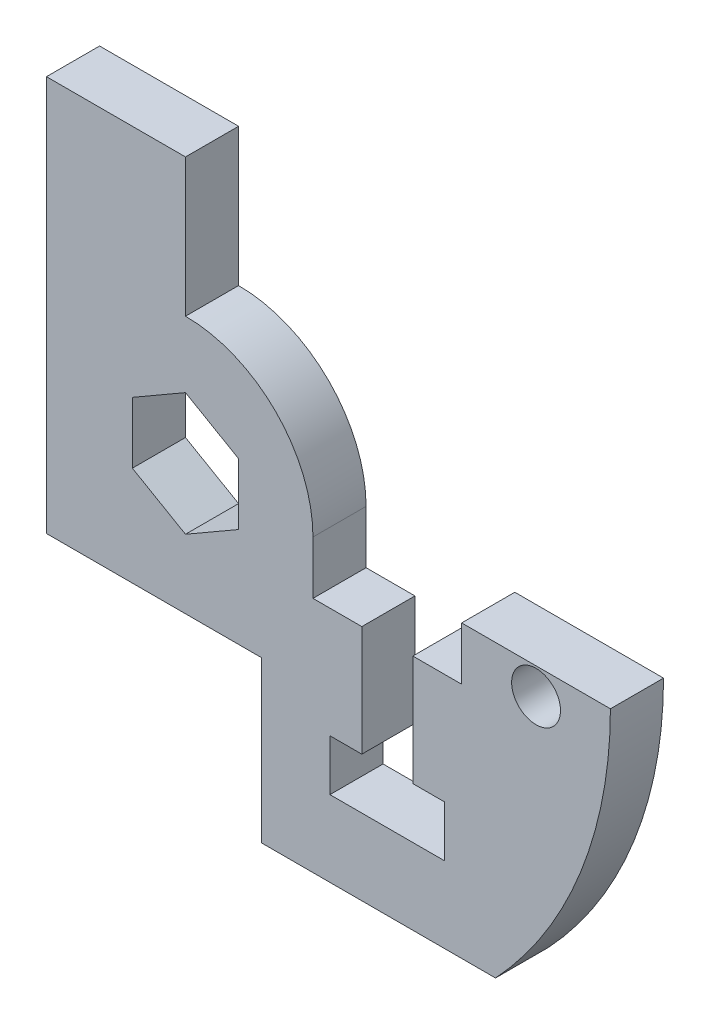
ISO-10303-21;
HEADER;
FILE_DESCRIPTION(('STEP AP214'),'2;1');
FILE_NAME('part.step','',(''),(''),'','','');
FILE_SCHEMA(('AUTOMOTIVE_DESIGN { 1 0 10303 214 1 1 1 1 }'));
ENDSEC;
DATA;
#1=APPLICATION_CONTEXT('core data for automotive mechanical design processes');
#2=APPLICATION_PROTOCOL_DEFINITION('international standard','automotive_design',2000,#1);
#3=PRODUCT_CONTEXT('',#1,'mechanical');
#4=PRODUCT('Part','Part','',(#3));
#5=PRODUCT_RELATED_PRODUCT_CATEGORY('part','',(#4));
#6=PRODUCT_DEFINITION_FORMATION('','',#4);
#7=PRODUCT_DEFINITION_CONTEXT('part definition',#1,'design');
#8=PRODUCT_DEFINITION('design','',#6,#7);
#9=PRODUCT_DEFINITION_SHAPE('','',#8);
#10=(LENGTH_UNIT() NAMED_UNIT(*) SI_UNIT(.MILLI.,.METRE.));
#11=(NAMED_UNIT(*) PLANE_ANGLE_UNIT() SI_UNIT($,.RADIAN.));
#12=(NAMED_UNIT(*) SI_UNIT($,.STERADIAN.) SOLID_ANGLE_UNIT());
#13=UNCERTAINTY_MEASURE_WITH_UNIT(LENGTH_MEASURE(1.E-05),#10,'distance_accuracy_value','');
#14=(GEOMETRIC_REPRESENTATION_CONTEXT(3) GLOBAL_UNCERTAINTY_ASSIGNED_CONTEXT((#13)) GLOBAL_UNIT_ASSIGNED_CONTEXT((#10,
#11,#12)) REPRESENTATION_CONTEXT('',''));
#15=CARTESIAN_POINT('',(0.,0.,0.));
#16=DIRECTION('',(0.,0.,1.));
#17=DIRECTION('',(1.,0.,0.));
#18=AXIS2_PLACEMENT_3D('',#15,#16,#17);
#19=CARTESIAN_POINT('',(0.,0.,3.175));
#20=DIRECTION('',(0.,0.,-1.));
#21=DIRECTION('',(-1.,0.,0.));
#22=AXIS2_PLACEMENT_3D('',#19,#20,#21);
#23=CYLINDRICAL_SURFACE('',#22,25.4);
#24=CARTESIAN_POINT('',(0.,0.,3.175));
#25=DIRECTION('',(0.,0.,1.));
#26=DIRECTION('',(1.,0.,0.));
#27=AXIS2_PLACEMENT_3D('',#24,#25,#26);
#28=CIRCLE('',#27,25.4);
#29=CARTESIAN_POINT('',(18.5310926745735,-17.371200427327,3.175));
#30=VERTEX_POINT('',#29);
#31=CARTESIAN_POINT('',(25.4,0.,3.175));
#32=VERTEX_POINT('',#31);
#33=EDGE_CURVE('E302',#30,#32,#28,.T.);
#34=ORIENTED_EDGE('',*,*,#33,.F.);
#35=DIRECTION('',(0.,0.,-1.));
#36=VECTOR('',#35,1.);
#37=CARTESIAN_POINT('',(18.5310926745735,-17.371200427327,3.175));
#38=LINE('',#37,#36);
#39=CARTESIAN_POINT('',(18.5310926745735,-17.371200427327,0.));
#40=VERTEX_POINT('',#39);
#41=EDGE_CURVE('E224',#30,#40,#38,.T.);
#42=ORIENTED_EDGE('',*,*,#41,.T.);
#43=CARTESIAN_POINT('',(0.,0.,0.));
#44=DIRECTION('',(0.,0.,1.));
#45=DIRECTION('',(1.,0.,0.));
#46=AXIS2_PLACEMENT_3D('',#43,#44,#45);
#47=CIRCLE('',#46,25.4);
#48=CARTESIAN_POINT('',(25.4,0.,0.));
#49=VERTEX_POINT('',#48);
#50=EDGE_CURVE('E233',#40,#49,#47,.T.);
#51=ORIENTED_EDGE('',*,*,#50,.T.);
#52=DIRECTION('',(0.,0.,-1.));
#53=VECTOR('',#52,1.);
#54=CARTESIAN_POINT('',(25.4,0.,3.175));
#55=LINE('',#54,#53);
#56=EDGE_CURVE('E454',#32,#49,#55,.T.);
#57=ORIENTED_EDGE('',*,*,#56,.F.);
#58=EDGE_LOOP('',(#34,#42,#51,#57));
#59=FACE_BOUND('',#58,.T.);
#60=ADVANCED_FACE('F42',(#59),#23,.T.);
#61=CARTESIAN_POINT('',(7.62,0.,3.175));
#62=DIRECTION('',(1.,0.,0.));
#63=DIRECTION('',(0.,0.,-1.));
#64=AXIS2_PLACEMENT_3D('',#61,#62,#63);
#65=PLANE('',#64);
#66=DIRECTION('',(0.,-1.,0.));
#67=VECTOR('',#66,1.);
#68=CARTESIAN_POINT('',(7.62,0.,0.));
#69=LINE('',#68,#67);
#70=CARTESIAN_POINT('',(7.62,0.,0.));
#71=VERTEX_POINT('',#70);
#72=CARTESIAN_POINT('',(7.62,-3.175,0.));
#73=VERTEX_POINT('',#72);
#74=EDGE_CURVE('E368',#71,#73,#69,.T.);
#75=ORIENTED_EDGE('',*,*,#74,.F.);
#76=DIRECTION('',(0.,0.,-1.));
#77=VECTOR('',#76,1.);
#78=CARTESIAN_POINT('',(7.62,0.,3.175));
#79=LINE('',#78,#77);
#80=CARTESIAN_POINT('',(7.62,0.,3.175));
#81=VERTEX_POINT('',#80);
#82=EDGE_CURVE('E11',#81,#71,#79,.T.);
#83=ORIENTED_EDGE('',*,*,#82,.F.);
#84=DIRECTION('',(0.,-1.,0.));
#85=VECTOR('',#84,1.);
#86=CARTESIAN_POINT('',(7.62,0.,3.175));
#87=LINE('',#86,#85);
#88=CARTESIAN_POINT('',(7.62,-3.175,3.175));
#89=VERTEX_POINT('',#88);
#90=EDGE_CURVE('E291',#81,#89,#87,.T.);
#91=ORIENTED_EDGE('',*,*,#90,.T.);
#92=DIRECTION('',(0.,0.,-1.));
#93=VECTOR('',#92,1.);
#94=CARTESIAN_POINT('',(7.62,-3.175,3.175));
#95=LINE('',#94,#93);
#96=EDGE_CURVE('E418',#89,#73,#95,.T.);
#97=ORIENTED_EDGE('',*,*,#96,.T.);
#98=EDGE_LOOP('',(#75,#83,#91,#97));
#99=FACE_BOUND('',#98,.T.);
#100=ADVANCED_FACE('F513',(#99),#65,.T.);
#101=CARTESIAN_POINT('',(0.,0.,3.175));
#102=DIRECTION('',(0.,0.,-1.));
#103=DIRECTION('',(-1.,0.,0.));
#104=AXIS2_PLACEMENT_3D('',#101,#102,#103);
#105=CYLINDRICAL_SURFACE('',#104,7.62);
#106=CARTESIAN_POINT('',(0.,0.,0.));
#107=DIRECTION('',(0.,0.,1.));
#108=DIRECTION('',(1.,0.,0.));
#109=AXIS2_PLACEMENT_3D('',#106,#107,#108);
#110=CIRCLE('',#109,7.62);
#111=CARTESIAN_POINT('',(0.,7.62,0.));
#112=VERTEX_POINT('',#111);
#113=EDGE_CURVE('E372',#71,#112,#110,.T.);
#114=ORIENTED_EDGE('',*,*,#113,.T.);
#115=DIRECTION('',(0.,0.,-1.));
#116=VECTOR('',#115,1.);
#117=CARTESIAN_POINT('',(0.,7.62,3.175));
#118=LINE('',#117,#116);
#119=CARTESIAN_POINT('',(0.,7.62,3.175));
#120=VERTEX_POINT('',#119);
#121=EDGE_CURVE('E52',#120,#112,#118,.T.);
#122=ORIENTED_EDGE('',*,*,#121,.F.);
#123=CARTESIAN_POINT('',(0.,0.,3.175));
#124=DIRECTION('',(0.,0.,1.));
#125=DIRECTION('',(1.,0.,0.));
#126=AXIS2_PLACEMENT_3D('',#123,#124,#125);
#127=CIRCLE('',#126,7.62);
#128=EDGE_CURVE('E295',#81,#120,#127,.T.);
#129=ORIENTED_EDGE('',*,*,#128,.F.);
#130=ORIENTED_EDGE('',*,*,#82,.T.);
#131=EDGE_LOOP('',(#114,#122,#129,#130));
#132=FACE_BOUND('',#131,.T.);
#133=ADVANCED_FACE('F521',(#132),#105,.T.);
#134=CARTESIAN_POINT('',(0.,0.,3.175));
#135=DIRECTION('',(1.,0.,0.));
#136=DIRECTION('',(0.,1.,0.));
#137=AXIS2_PLACEMENT_3D('',#134,#135,#136);
#138=PLANE('',#137);
#139=DIRECTION('',(0.,0.,-1.));
#140=VECTOR('',#139,1.);
#141=CARTESIAN_POINT('',(0.,15.8669720038918,3.176));
#142=LINE('',#141,#140);
#143=CARTESIAN_POINT('',(0.,15.8669720038918,3.175));
#144=VERTEX_POINT('',#143);
#145=CARTESIAN_POINT('',(0.,15.8669720038918,0.));
#146=VERTEX_POINT('',#145);
#147=EDGE_CURVE('E250',#144,#146,#142,.T.);
#148=ORIENTED_EDGE('',*,*,#147,.F.);
#149=DIRECTION('',(0.,-1.,0.));
#150=VECTOR('',#149,1.);
#151=CARTESIAN_POINT('',(0.,0.,3.175));
#152=LINE('',#151,#150);
#153=EDGE_CURVE('E299',#144,#120,#152,.T.);
#154=ORIENTED_EDGE('',*,*,#153,.T.);
#155=ORIENTED_EDGE('',*,*,#121,.T.);
#156=DIRECTION('',(0.,-1.,0.));
#157=VECTOR('',#156,1.);
#158=CARTESIAN_POINT('',(0.,0.,0.));
#159=LINE('',#158,#157);
#160=EDGE_CURVE('E376',#146,#112,#159,.T.);
#161=ORIENTED_EDGE('',*,*,#160,.F.);
#162=EDGE_LOOP('',(#148,#154,#155,#161));
#163=FACE_BOUND('',#162,.T.);
#164=ADVANCED_FACE('F528',(#163),#138,.T.);
#165=CARTESIAN_POINT('',(0.,0.,3.175));
#166=DIRECTION('',(0.,-1.,0.));
#167=DIRECTION('',(1.,0.,0.));
#168=AXIS2_PLACEMENT_3D('',#165,#166,#167);
#169=PLANE('',#168);
#170=DIRECTION('',(-1.,0.,0.));
#171=VECTOR('',#170,1.);
#172=CARTESIAN_POINT('',(0.,0.,0.));
#173=LINE('',#172,#171);
#174=CARTESIAN_POINT('',(16.51,0.,0.));
#175=VERTEX_POINT('',#174);
#176=EDGE_CURVE('E381',#49,#175,#173,.T.);
#177=ORIENTED_EDGE('',*,*,#176,.T.);
#178=DIRECTION('',(0.,0.,-1.));
#179=VECTOR('',#178,1.);
#180=CARTESIAN_POINT('',(16.51,0.,3.175));
#181=LINE('',#180,#179);
#182=CARTESIAN_POINT('',(16.51,0.,3.175));
#183=VERTEX_POINT('',#182);
#184=EDGE_CURVE('E450',#183,#175,#181,.T.);
#185=ORIENTED_EDGE('',*,*,#184,.F.);
#186=DIRECTION('',(-1.,0.,0.));
#187=VECTOR('',#186,1.);
#188=CARTESIAN_POINT('',(0.,0.,3.175));
#189=LINE('',#188,#187);
#190=EDGE_CURVE('E305',#32,#183,#189,.T.);
#191=ORIENTED_EDGE('',*,*,#190,.F.);
#192=ORIENTED_EDGE('',*,*,#56,.T.);
#193=EDGE_LOOP('',(#177,#185,#191,#192));
#194=FACE_BOUND('',#193,.T.);
#195=ADVANCED_FACE('F526',(#194),#169,.F.);
#196=CARTESIAN_POINT('',(16.51,0.,3.175));
#197=DIRECTION('',(1.,0.,0.));
#198=DIRECTION('',(0.,0.,-1.));
#199=AXIS2_PLACEMENT_3D('',#196,#197,#198);
#200=PLANE('',#199);
#201=DIRECTION('',(0.,-1.,0.));
#202=VECTOR('',#201,1.);
#203=CARTESIAN_POINT('',(16.51,0.,0.));
#204=LINE('',#203,#202);
#205=CARTESIAN_POINT('',(16.51,-3.175,0.));
#206=VERTEX_POINT('',#205);
#207=EDGE_CURVE('E385',#175,#206,#204,.T.);
#208=ORIENTED_EDGE('',*,*,#207,.T.);
#209=DIRECTION('',(0.,0.,-1.));
#210=VECTOR('',#209,1.);
#211=CARTESIAN_POINT('',(16.51,-3.175,3.175));
#212=LINE('',#211,#210);
#213=CARTESIAN_POINT('',(16.51,-3.175,3.175));
#214=VERTEX_POINT('',#213);
#215=EDGE_CURVE('E447',#214,#206,#212,.T.);
#216=ORIENTED_EDGE('',*,*,#215,.F.);
#217=DIRECTION('',(0.,-1.,0.));
#218=VECTOR('',#217,1.);
#219=CARTESIAN_POINT('',(16.51,0.,3.175));
#220=LINE('',#219,#218);
#221=EDGE_CURVE('E309',#183,#214,#220,.T.);
#222=ORIENTED_EDGE('',*,*,#221,.F.);
#223=ORIENTED_EDGE('',*,*,#184,.T.);
#224=EDGE_LOOP('',(#208,#216,#222,#223));
#225=FACE_BOUND('',#224,.T.);
#226=ADVANCED_FACE('F589',(#225),#200,.F.);
#227=CARTESIAN_POINT('',(0.,-3.175,3.175));
#228=DIRECTION('',(0.,1.,0.));
#229=DIRECTION('',(0.,0.,1.));
#230=AXIS2_PLACEMENT_3D('',#227,#228,#229);
#231=PLANE('',#230);
#232=DIRECTION('',(1.,0.,0.));
#233=VECTOR('',#232,1.);
#234=CARTESIAN_POINT('',(0.,-3.175,0.));
#235=LINE('',#234,#233);
#236=CARTESIAN_POINT('',(13.589,-3.175,0.));
#237=VERTEX_POINT('',#236);
#238=EDGE_CURVE('E389',#237,#206,#235,.T.);
#239=ORIENTED_EDGE('',*,*,#238,.F.);
#240=DIRECTION('',(0.,0.,-1.));
#241=VECTOR('',#240,1.);
#242=CARTESIAN_POINT('',(13.589,-3.175,3.175));
#243=LINE('',#242,#241);
#244=CARTESIAN_POINT('',(13.589,-3.175,3.175));
#245=VERTEX_POINT('',#244);
#246=EDGE_CURVE('E444',#245,#237,#243,.T.);
#247=ORIENTED_EDGE('',*,*,#246,.F.);
#248=DIRECTION('',(1.,0.,0.));
#249=VECTOR('',#248,1.);
#250=CARTESIAN_POINT('',(0.,-3.175,3.175));
#251=LINE('',#250,#249);
#252=EDGE_CURVE('E312',#245,#214,#251,.T.);
#253=ORIENTED_EDGE('',*,*,#252,.T.);
#254=ORIENTED_EDGE('',*,*,#215,.T.);
#255=EDGE_LOOP('',(#239,#247,#253,#254));
#256=FACE_BOUND('',#255,.T.);
#257=ADVANCED_FACE('F584',(#256),#231,.T.);
#258=CARTESIAN_POINT('',(13.589,0.,3.175));
#259=DIRECTION('',(1.,0.,0.));
#260=DIRECTION('',(0.,1.,0.));
#261=AXIS2_PLACEMENT_3D('',#258,#259,#260);
#262=PLANE('',#261);
#263=DIRECTION('',(0.,-1.,0.));
#264=VECTOR('',#263,1.);
#265=CARTESIAN_POINT('',(13.589,0.,0.));
#266=LINE('',#265,#264);
#267=CARTESIAN_POINT('',(13.589,-9.779,0.));
#268=VERTEX_POINT('',#267);
#269=EDGE_CURVE('E393',#237,#268,#266,.T.);
#270=ORIENTED_EDGE('',*,*,#269,.T.);
#271=DIRECTION('',(0.,0.,-1.));
#272=VECTOR('',#271,1.);
#273=CARTESIAN_POINT('',(13.589,-9.779,3.175));
#274=LINE('',#273,#272);
#275=CARTESIAN_POINT('',(13.589,-9.779,3.175));
#276=VERTEX_POINT('',#275);
#277=EDGE_CURVE('E440',#276,#268,#274,.T.);
#278=ORIENTED_EDGE('',*,*,#277,.F.);
#279=DIRECTION('',(0.,-1.,0.));
#280=VECTOR('',#279,1.);
#281=CARTESIAN_POINT('',(13.589,0.,3.175));
#282=LINE('',#281,#280);
#283=EDGE_CURVE('E316',#245,#276,#282,.T.);
#284=ORIENTED_EDGE('',*,*,#283,.F.);
#285=ORIENTED_EDGE('',*,*,#246,.T.);
#286=EDGE_LOOP('',(#270,#278,#284,#285));
#287=FACE_BOUND('',#286,.T.);
#288=ADVANCED_FACE('F622',(#287),#262,.F.);
#289=CARTESIAN_POINT('',(0.,-9.779,3.175));
#290=DIRECTION('',(0.,1.,0.));
#291=DIRECTION('',(-1.,0.,0.));
#292=AXIS2_PLACEMENT_3D('',#289,#290,#291);
#293=PLANE('',#292);
#294=DIRECTION('',(1.,0.,0.));
#295=VECTOR('',#294,1.);
#296=CARTESIAN_POINT('',(0.,-9.779,0.));
#297=LINE('',#296,#295);
#298=CARTESIAN_POINT('',(15.494,-9.779,0.));
#299=VERTEX_POINT('',#298);
#300=EDGE_CURVE('E397',#268,#299,#297,.T.);
#301=ORIENTED_EDGE('',*,*,#300,.T.);
#302=DIRECTION('',(0.,0.,-1.));
#303=VECTOR('',#302,1.);
#304=CARTESIAN_POINT('',(15.494,-9.779,3.175));
#305=LINE('',#304,#303);
#306=CARTESIAN_POINT('',(15.494,-9.779,3.175));
#307=VERTEX_POINT('',#306);
#308=EDGE_CURVE('E436',#307,#299,#305,.T.);
#309=ORIENTED_EDGE('',*,*,#308,.F.);
#310=DIRECTION('',(1.,0.,0.));
#311=VECTOR('',#310,1.);
#312=CARTESIAN_POINT('',(0.,-9.779,3.175));
#313=LINE('',#312,#311);
#314=EDGE_CURVE('E321',#276,#307,#313,.T.);
#315=ORIENTED_EDGE('',*,*,#314,.F.);
#316=ORIENTED_EDGE('',*,*,#277,.T.);
#317=EDGE_LOOP('',(#301,#309,#315,#316));
#318=FACE_BOUND('',#317,.T.);
#319=ADVANCED_FACE('F578',(#318),#293,.F.);
#320=CARTESIAN_POINT('',(15.494,0.,3.175));
#321=DIRECTION('',(1.,0.,0.));
#322=DIRECTION('',(0.,0.,-1.));
#323=AXIS2_PLACEMENT_3D('',#320,#321,#322);
#324=PLANE('',#323);
#325=DIRECTION('',(0.,-1.,0.));
#326=VECTOR('',#325,1.);
#327=CARTESIAN_POINT('',(15.494,0.,0.));
#328=LINE('',#327,#326);
#329=CARTESIAN_POINT('',(15.494,-12.827,0.));
#330=VERTEX_POINT('',#329);
#331=EDGE_CURVE('E401',#299,#330,#328,.T.);
#332=ORIENTED_EDGE('',*,*,#331,.T.);
#333=DIRECTION('',(0.,0.,-1.));
#334=VECTOR('',#333,1.);
#335=CARTESIAN_POINT('',(15.494,-12.827,3.175));
#336=LINE('',#335,#334);
#337=CARTESIAN_POINT('',(15.494,-12.827,3.175));
#338=VERTEX_POINT('',#337);
#339=EDGE_CURVE('E433',#338,#330,#336,.T.);
#340=ORIENTED_EDGE('',*,*,#339,.F.);
#341=DIRECTION('',(0.,-1.,0.));
#342=VECTOR('',#341,1.);
#343=CARTESIAN_POINT('',(15.494,0.,3.175));
#344=LINE('',#343,#342);
#345=EDGE_CURVE('E325',#307,#338,#344,.T.);
#346=ORIENTED_EDGE('',*,*,#345,.F.);
#347=ORIENTED_EDGE('',*,*,#308,.T.);
#348=EDGE_LOOP('',(#332,#340,#346,#347));
#349=FACE_BOUND('',#348,.T.);
#350=ADVANCED_FACE('F575',(#349),#324,.F.);
#351=CARTESIAN_POINT('',(0.,-12.827,3.175));
#352=DIRECTION('',(0.,1.,0.));
#353=DIRECTION('',(-1.,0.,0.));
#354=AXIS2_PLACEMENT_3D('',#351,#352,#353);
#355=PLANE('',#354);
#356=DIRECTION('',(1.,0.,0.));
#357=VECTOR('',#356,1.);
#358=CARTESIAN_POINT('',(0.,-12.827,0.));
#359=LINE('',#358,#357);
#360=CARTESIAN_POINT('',(8.636,-12.827,0.));
#361=VERTEX_POINT('',#360);
#362=EDGE_CURVE('E406',#361,#330,#359,.T.);
#363=ORIENTED_EDGE('',*,*,#362,.F.);
#364=DIRECTION('',(0.,0.,-1.));
#365=VECTOR('',#364,1.);
#366=CARTESIAN_POINT('',(8.636,-12.827,3.175));
#367=LINE('',#366,#365);
#368=CARTESIAN_POINT('',(8.636,-12.827,3.175));
#369=VERTEX_POINT('',#368);
#370=EDGE_CURVE('E430',#369,#361,#367,.T.);
#371=ORIENTED_EDGE('',*,*,#370,.F.);
#372=DIRECTION('',(1.,0.,0.));
#373=VECTOR('',#372,1.);
#374=CARTESIAN_POINT('',(0.,-12.827,3.175));
#375=LINE('',#374,#373);
#376=EDGE_CURVE('E329',#369,#338,#375,.T.);
#377=ORIENTED_EDGE('',*,*,#376,.T.);
#378=ORIENTED_EDGE('',*,*,#339,.T.);
#379=EDGE_LOOP('',(#363,#371,#377,#378));
#380=FACE_BOUND('',#379,.T.);
#381=ADVANCED_FACE('F572',(#380),#355,.T.);
#382=CARTESIAN_POINT('',(8.636,0.,3.175));
#383=DIRECTION('',(1.,0.,0.));
#384=DIRECTION('',(0.,0.,-1.));
#385=AXIS2_PLACEMENT_3D('',#382,#383,#384);
#386=PLANE('',#385);
#387=DIRECTION('',(0.,-1.,0.));
#388=VECTOR('',#387,1.);
#389=CARTESIAN_POINT('',(8.636,0.,0.));
#390=LINE('',#389,#388);
#391=CARTESIAN_POINT('',(8.636,-9.779,0.));
#392=VERTEX_POINT('',#391);
#393=EDGE_CURVE('E410',#392,#361,#390,.T.);
#394=ORIENTED_EDGE('',*,*,#393,.F.);
#395=DIRECTION('',(0.,0.,-1.));
#396=VECTOR('',#395,1.);
#397=CARTESIAN_POINT('',(8.636,-9.779,3.175));
#398=LINE('',#397,#396);
#399=CARTESIAN_POINT('',(8.636,-9.779,3.175));
#400=VERTEX_POINT('',#399);
#401=EDGE_CURVE('E427',#400,#392,#398,.T.);
#402=ORIENTED_EDGE('',*,*,#401,.F.);
#403=DIRECTION('',(0.,-1.,0.));
#404=VECTOR('',#403,1.);
#405=CARTESIAN_POINT('',(8.636,0.,3.175));
#406=LINE('',#405,#404);
#407=EDGE_CURVE('E333',#400,#369,#406,.T.);
#408=ORIENTED_EDGE('',*,*,#407,.T.);
#409=ORIENTED_EDGE('',*,*,#370,.T.);
#410=EDGE_LOOP('',(#394,#402,#408,#409));
#411=FACE_BOUND('',#410,.T.);
#412=ADVANCED_FACE('F569',(#411),#386,.T.);
#413=CARTESIAN_POINT('',(10.541,-9.779,0.));
#414=VERTEX_POINT('',#413);
#415=EDGE_CURVE('E402',#392,#414,#297,.T.);
#416=ORIENTED_EDGE('',*,*,#415,.T.);
#417=DIRECTION('',(0.,0.,-1.));
#418=VECTOR('',#417,1.);
#419=CARTESIAN_POINT('',(10.541,-9.779,3.175));
#420=LINE('',#419,#418);
#421=CARTESIAN_POINT('',(10.541,-9.779,3.175));
#422=VERTEX_POINT('',#421);
#423=EDGE_CURVE('E424',#422,#414,#420,.T.);
#424=ORIENTED_EDGE('',*,*,#423,.F.);
#425=EDGE_CURVE('E326',#400,#422,#313,.T.);
#426=ORIENTED_EDGE('',*,*,#425,.F.);
#427=ORIENTED_EDGE('',*,*,#401,.T.);
#428=EDGE_LOOP('',(#416,#424,#426,#427));
#429=FACE_BOUND('',#428,.T.);
#430=ADVANCED_FACE('F556',(#429),#293,.F.);
#431=CARTESIAN_POINT('',(10.541,0.,3.175));
#432=DIRECTION('',(1.,0.,0.));
#433=DIRECTION('',(0.,1.,0.));
#434=AXIS2_PLACEMENT_3D('',#431,#432,#433);
#435=PLANE('',#434);
#436=DIRECTION('',(0.,-1.,0.));
#437=VECTOR('',#436,1.);
#438=CARTESIAN_POINT('',(10.541,0.,0.));
#439=LINE('',#438,#437);
#440=CARTESIAN_POINT('',(10.541,-3.175,0.));
#441=VERTEX_POINT('',#440);
#442=EDGE_CURVE('E414',#441,#414,#439,.T.);
#443=ORIENTED_EDGE('',*,*,#442,.F.);
#444=DIRECTION('',(0.,0.,-1.));
#445=VECTOR('',#444,1.);
#446=CARTESIAN_POINT('',(10.541,-3.175,3.175));
#447=LINE('',#446,#445);
#448=CARTESIAN_POINT('',(10.541,-3.175,3.175));
#449=VERTEX_POINT('',#448);
#450=EDGE_CURVE('E421',#449,#441,#447,.T.);
#451=ORIENTED_EDGE('',*,*,#450,.F.);
#452=DIRECTION('',(0.,-1.,0.));
#453=VECTOR('',#452,1.);
#454=CARTESIAN_POINT('',(10.541,0.,3.175));
#455=LINE('',#454,#453);
#456=EDGE_CURVE('E337',#449,#422,#455,.T.);
#457=ORIENTED_EDGE('',*,*,#456,.T.);
#458=ORIENTED_EDGE('',*,*,#423,.T.);
#459=EDGE_LOOP('',(#443,#451,#457,#458));
#460=FACE_BOUND('',#459,.T.);
#461=ADVANCED_FACE('F560',(#460),#435,.T.);
#462=CARTESIAN_POINT('',(1.5875,-2.74963065701559,3.175));
#463=DIRECTION('',(-0.500000000000001,0.866025403784438,0.));
#464=DIRECTION('',(-0.866025403784438,-0.500000000000001,0.));
#465=AXIS2_PLACEMENT_3D('',#462,#463,#464);
#466=PLANE('',#465);
#467=DIRECTION('',(0.866025403784438,0.500000000000001,0.));
#468=VECTOR('',#467,1.);
#469=CARTESIAN_POINT('',(1.5875,-2.74963065701559,0.));
#470=LINE('',#469,#468);
#471=CARTESIAN_POINT('',(0.,-3.66617420935412,0.));
#472=VERTEX_POINT('',#471);
#473=CARTESIAN_POINT('',(3.175,-1.83308710467706,0.));
#474=VERTEX_POINT('',#473);
#475=EDGE_CURVE('E344',#472,#474,#470,.T.);
#476=ORIENTED_EDGE('',*,*,#475,.F.);
#477=DIRECTION('',(0.,0.,-1.));
#478=VECTOR('',#477,1.);
#479=CARTESIAN_POINT('',(0.,-3.66617420935412,3.175));
#480=LINE('',#479,#478);
#481=CARTESIAN_POINT('',(0.,-3.66617420935412,3.175));
#482=VERTEX_POINT('',#481);
#483=EDGE_CURVE('E46',#482,#472,#480,.T.);
#484=ORIENTED_EDGE('',*,*,#483,.F.);
#485=DIRECTION('',(0.866025403784438,0.500000000000001,0.));
#486=VECTOR('',#485,1.);
#487=CARTESIAN_POINT('',(1.5875,-2.74963065701559,3.175));
#488=LINE('',#487,#486);
#489=CARTESIAN_POINT('',(3.175,-1.83308710467706,3.175));
#490=VERTEX_POINT('',#489);
#491=EDGE_CURVE('E266',#482,#490,#488,.T.);
#492=ORIENTED_EDGE('',*,*,#491,.T.);
#493=DIRECTION('',(0.,0.,-1.));
#494=VECTOR('',#493,1.);
#495=CARTESIAN_POINT('',(3.175,-1.83308710467706,3.175));
#496=LINE('',#495,#494);
#497=EDGE_CURVE('E461',#490,#474,#496,.T.);
#498=ORIENTED_EDGE('',*,*,#497,.T.);
#499=EDGE_LOOP('',(#476,#484,#492,#498));
#500=FACE_BOUND('',#499,.T.);
#501=ADVANCED_FACE('F484',(#500),#466,.T.);
#502=CARTESIAN_POINT('',(-1.5875,-2.74963065701559,3.175));
#503=DIRECTION('',(0.5,0.866025403784439,0.));
#504=DIRECTION('',(-0.866025403784439,0.5,0.));
#505=AXIS2_PLACEMENT_3D('',#502,#503,#504);
#506=PLANE('',#505);
#507=DIRECTION('',(0.866025403784439,-0.5,0.));
#508=VECTOR('',#507,1.);
#509=CARTESIAN_POINT('',(-1.5875,-2.74963065701559,0.));
#510=LINE('',#509,#508);
#511=CARTESIAN_POINT('',(-3.175,-1.83308710467706,0.));
#512=VERTEX_POINT('',#511);
#513=EDGE_CURVE('E348',#512,#472,#510,.T.);
#514=ORIENTED_EDGE('',*,*,#513,.F.);
#515=DIRECTION('',(0.,0.,-1.));
#516=VECTOR('',#515,1.);
#517=CARTESIAN_POINT('',(-3.175,-1.83308710467706,3.175));
#518=LINE('',#517,#516);
#519=CARTESIAN_POINT('',(-3.175,-1.83308710467706,3.175));
#520=VERTEX_POINT('',#519);
#521=EDGE_CURVE('E472',#520,#512,#518,.T.);
#522=ORIENTED_EDGE('',*,*,#521,.F.);
#523=DIRECTION('',(0.866025403784439,-0.5,0.));
#524=VECTOR('',#523,1.);
#525=CARTESIAN_POINT('',(-1.5875,-2.74963065701559,3.175));
#526=LINE('',#525,#524);
#527=EDGE_CURVE('E271',#520,#482,#526,.T.);
#528=ORIENTED_EDGE('',*,*,#527,.T.);
#529=ORIENTED_EDGE('',*,*,#483,.T.);
#530=EDGE_LOOP('',(#514,#522,#528,#529));
#531=FACE_BOUND('',#530,.T.);
#532=ADVANCED_FACE('F480',(#531),#506,.T.);
#533=CARTESIAN_POINT('',(-3.175,0.,3.175));
#534=DIRECTION('',(1.,0.,0.));
#535=DIRECTION('',(0.,1.,0.));
#536=AXIS2_PLACEMENT_3D('',#533,#534,#535);
#537=PLANE('',#536);
#538=DIRECTION('',(0.,-1.,0.));
#539=VECTOR('',#538,1.);
#540=CARTESIAN_POINT('',(-3.175,0.,0.));
#541=LINE('',#540,#539);
#542=CARTESIAN_POINT('',(-3.175,1.83308710467706,0.));
#543=VERTEX_POINT('',#542);
#544=EDGE_CURVE('E352',#543,#512,#541,.T.);
#545=ORIENTED_EDGE('',*,*,#544,.F.);
#546=DIRECTION('',(0.,0.,-1.));
#547=VECTOR('',#546,1.);
#548=CARTESIAN_POINT('',(-3.175,1.83308710467706,3.175));
#549=LINE('',#548,#547);
#550=CARTESIAN_POINT('',(-3.175,1.83308710467706,3.175));
#551=VERTEX_POINT('',#550);
#552=EDGE_CURVE('E470',#551,#543,#549,.T.);
#553=ORIENTED_EDGE('',*,*,#552,.F.);
#554=DIRECTION('',(0.,-1.,0.));
#555=VECTOR('',#554,1.);
#556=CARTESIAN_POINT('',(-3.175,0.,3.175));
#557=LINE('',#556,#555);
#558=EDGE_CURVE('E275',#551,#520,#557,.T.);
#559=ORIENTED_EDGE('',*,*,#558,.T.);
#560=ORIENTED_EDGE('',*,*,#521,.T.);
#561=EDGE_LOOP('',(#545,#553,#559,#560));
#562=FACE_BOUND('',#561,.T.);
#563=ADVANCED_FACE('F488',(#562),#537,.T.);
#564=CARTESIAN_POINT('',(-1.5875,2.74963065701559,3.175));
#565=DIRECTION('',(0.5,-0.866025403784438,0.));
#566=DIRECTION('',(0.866025403784439,0.5,0.));
#567=AXIS2_PLACEMENT_3D('',#564,#565,#566);
#568=PLANE('',#567);
#569=DIRECTION('',(-0.866025403784439,-0.5,0.));
#570=VECTOR('',#569,1.);
#571=CARTESIAN_POINT('',(-1.5875,2.74963065701559,0.));
#572=LINE('',#571,#570);
#573=CARTESIAN_POINT('',(0.,3.66617420935412,0.));
#574=VERTEX_POINT('',#573);
#575=EDGE_CURVE('E356',#574,#543,#572,.T.);
#576=ORIENTED_EDGE('',*,*,#575,.F.);
#577=DIRECTION('',(0.,0.,-1.));
#578=VECTOR('',#577,1.);
#579=CARTESIAN_POINT('',(0.,3.66617420935412,3.175));
#580=LINE('',#579,#578);
#581=CARTESIAN_POINT('',(0.,3.66617420935412,3.175));
#582=VERTEX_POINT('',#581);
#583=EDGE_CURVE('E467',#582,#574,#580,.T.);
#584=ORIENTED_EDGE('',*,*,#583,.F.);
#585=DIRECTION('',(-0.866025403784439,-0.5,0.));
#586=VECTOR('',#585,1.);
#587=CARTESIAN_POINT('',(-1.5875,2.74963065701559,3.175));
#588=LINE('',#587,#586);
#589=EDGE_CURVE('E279',#582,#551,#588,.T.);
#590=ORIENTED_EDGE('',*,*,#589,.T.);
#591=ORIENTED_EDGE('',*,*,#552,.T.);
#592=EDGE_LOOP('',(#576,#584,#590,#591));
#593=FACE_BOUND('',#592,.T.);
#594=ADVANCED_FACE('F495',(#593),#568,.T.);
#595=CARTESIAN_POINT('',(1.5875,2.74963065701559,3.175));
#596=DIRECTION('',(-0.5,-0.866025403784439,0.));
#597=DIRECTION('',(0.866025403784439,-0.5,0.));
#598=AXIS2_PLACEMENT_3D('',#595,#596,#597);
#599=PLANE('',#598);
#600=DIRECTION('',(-0.866025403784439,0.5,0.));
#601=VECTOR('',#600,1.);
#602=CARTESIAN_POINT('',(1.5875,2.74963065701559,0.));
#603=LINE('',#602,#601);
#604=CARTESIAN_POINT('',(3.175,1.83308710467706,0.));
#605=VERTEX_POINT('',#604);
#606=EDGE_CURVE('E360',#605,#574,#603,.T.);
#607=ORIENTED_EDGE('',*,*,#606,.F.);
#608=DIRECTION('',(0.,0.,-1.));
#609=VECTOR('',#608,1.);
#610=CARTESIAN_POINT('',(3.175,1.83308710467706,3.175));
#611=LINE('',#610,#609);
#612=CARTESIAN_POINT('',(3.175,1.83308710467706,3.175));
#613=VERTEX_POINT('',#612);
#614=EDGE_CURVE('E464',#613,#605,#611,.T.);
#615=ORIENTED_EDGE('',*,*,#614,.F.);
#616=DIRECTION('',(-0.866025403784439,0.5,0.));
#617=VECTOR('',#616,1.);
#618=CARTESIAN_POINT('',(1.5875,2.74963065701559,3.175));
#619=LINE('',#618,#617);
#620=EDGE_CURVE('E283',#613,#582,#619,.T.);
#621=ORIENTED_EDGE('',*,*,#620,.T.);
#622=ORIENTED_EDGE('',*,*,#583,.T.);
#623=EDGE_LOOP('',(#607,#615,#621,#622));
#624=FACE_BOUND('',#623,.T.);
#625=ADVANCED_FACE('F498',(#624),#599,.T.);
#626=CARTESIAN_POINT('',(3.175,0.,3.175));
#627=DIRECTION('',(-1.,0.,0.));
#628=DIRECTION('',(0.,-1.,0.));
#629=AXIS2_PLACEMENT_3D('',#626,#627,#628);
#630=PLANE('',#629);
#631=DIRECTION('',(0.,1.,0.));
#632=VECTOR('',#631,1.);
#633=CARTESIAN_POINT('',(3.175,0.,0.));
#634=LINE('',#633,#632);
#635=EDGE_CURVE('E364',#474,#605,#634,.T.);
#636=ORIENTED_EDGE('',*,*,#635,.F.);
#637=ORIENTED_EDGE('',*,*,#497,.F.);
#638=DIRECTION('',(0.,1.,0.));
#639=VECTOR('',#638,1.);
#640=CARTESIAN_POINT('',(3.175,0.,3.175));
#641=LINE('',#640,#639);
#642=EDGE_CURVE('E287',#490,#613,#641,.T.);
#643=ORIENTED_EDGE('',*,*,#642,.T.);
#644=ORIENTED_EDGE('',*,*,#614,.T.);
#645=EDGE_LOOP('',(#636,#637,#643,#644));
#646=FACE_BOUND('',#645,.T.);
#647=ADVANCED_FACE('F501',(#646),#630,.T.);
#648=CARTESIAN_POINT('',(20.955,-1.5875,3.175));
#649=DIRECTION('',(0.,0.,-1.));
#650=DIRECTION('',(-1.,0.,0.));
#651=AXIS2_PLACEMENT_3D('',#648,#649,#650);
#652=CYLINDRICAL_SURFACE('',#651,1.4605);
#653=CARTESIAN_POINT('',(20.955,-1.5875,3.175));
#654=DIRECTION('',(0.,0.,1.));
#655=DIRECTION('',(1.,0.,0.));
#656=AXIS2_PLACEMENT_3D('',#653,#654,#655);
#657=CIRCLE('',#656,1.4605);
#658=CARTESIAN_POINT('',(22.4155,-1.5875,3.175));
#659=VERTEX_POINT('',#658);
#660=EDGE_CURVE('E262',#659,#659,#657,.T.);
#661=ORIENTED_EDGE('',*,*,#660,.T.);
#662=EDGE_LOOP('',(#661));
#663=FACE_BOUND('',#662,.T.);
#664=CARTESIAN_POINT('',(20.955,-1.5875,0.));
#665=DIRECTION('',(0.,0.,1.));
#666=DIRECTION('',(1.,0.,0.));
#667=AXIS2_PLACEMENT_3D('',#664,#665,#666);
#668=CIRCLE('',#667,1.4605);
#669=CARTESIAN_POINT('',(22.4155,-1.5875,0.));
#670=VERTEX_POINT('',#669);
#671=EDGE_CURVE('E261',#670,#670,#668,.T.);
#672=ORIENTED_EDGE('',*,*,#671,.F.);
#673=EDGE_LOOP('',(#672));
#674=FACE_BOUND('',#673,.T.);
#675=ADVANCED_FACE('F44',(#663,#674),#652,.F.);
#676=EDGE_CURVE('E267',#73,#441,#235,.T.);
#677=ORIENTED_EDGE('',*,*,#676,.F.);
#678=ORIENTED_EDGE('',*,*,#96,.F.);
#679=EDGE_CURVE('E317',#89,#449,#251,.T.);
#680=ORIENTED_EDGE('',*,*,#679,.T.);
#681=ORIENTED_EDGE('',*,*,#450,.T.);
#682=EDGE_LOOP('',(#677,#678,#680,#681));
#683=FACE_BOUND('',#682,.T.);
#684=ADVANCED_FACE('F508',(#683),#231,.T.);
#685=CARTESIAN_POINT('',(0.,0.,3.175));
#686=DIRECTION('',(0.,0.,1.));
#687=DIRECTION('',(1.,0.,0.));
#688=AXIS2_PLACEMENT_3D('',#685,#686,#687);
#689=PLANE('',#688);
#690=DIRECTION('',(1.,0.,0.));
#691=VECTOR('',#690,1.);
#692=CARTESIAN_POINT('',(4.53871140315937,-17.371200427327,3.175));
#693=LINE('',#692,#691);
#694=CARTESIAN_POINT('',(4.53871140315937,-17.371200427327,3.175));
#695=VERTEX_POINT('',#694);
#696=EDGE_CURVE('E60',#695,#30,#693,.T.);
#697=ORIENTED_EDGE('',*,*,#696,.T.);
#698=ORIENTED_EDGE('',*,*,#33,.T.);
#699=ORIENTED_EDGE('',*,*,#190,.T.);
#700=ORIENTED_EDGE('',*,*,#221,.T.);
#701=ORIENTED_EDGE('',*,*,#252,.F.);
#702=ORIENTED_EDGE('',*,*,#283,.T.);
#703=ORIENTED_EDGE('',*,*,#314,.T.);
#704=ORIENTED_EDGE('',*,*,#345,.T.);
#705=ORIENTED_EDGE('',*,*,#376,.F.);
#706=ORIENTED_EDGE('',*,*,#407,.F.);
#707=ORIENTED_EDGE('',*,*,#425,.T.);
#708=ORIENTED_EDGE('',*,*,#456,.F.);
#709=ORIENTED_EDGE('',*,*,#679,.F.);
#710=ORIENTED_EDGE('',*,*,#90,.F.);
#711=ORIENTED_EDGE('',*,*,#128,.T.);
#712=ORIENTED_EDGE('',*,*,#153,.F.);
#713=DIRECTION('',(-1.,0.,0.));
#714=VECTOR('',#713,1.);
#715=CARTESIAN_POINT('',(-8.3087129801425,15.8669720038918,3.175));
#716=LINE('',#715,#714);
#717=CARTESIAN_POINT('',(-8.3087129801425,15.8669720038918,3.175));
#718=VERTEX_POINT('',#717);
#719=EDGE_CURVE('E603',#144,#718,#716,.T.);
#720=ORIENTED_EDGE('',*,*,#719,.T.);
#721=DIRECTION('',(0.,-1.,0.));
#722=VECTOR('',#721,1.);
#723=CARTESIAN_POINT('',(-8.3087129801425,-7.78247939313495,3.175));
#724=LINE('',#723,#722);
#725=CARTESIAN_POINT('',(-8.3087129801425,-7.78247939313495,3.175));
#726=VERTEX_POINT('',#725);
#727=EDGE_CURVE('E607',#718,#726,#724,.T.);
#728=ORIENTED_EDGE('',*,*,#727,.T.);
#729=DIRECTION('',(1.,0.,0.));
#730=VECTOR('',#729,1.);
#731=CARTESIAN_POINT('',(4.53871140315937,-7.78247939313495,3.175));
#732=LINE('',#731,#730);
#733=CARTESIAN_POINT('',(4.53871140315937,-7.78247939313495,3.175));
#734=VERTEX_POINT('',#733);
#735=EDGE_CURVE('E258',#726,#734,#732,.T.);
#736=ORIENTED_EDGE('',*,*,#735,.T.);
#737=DIRECTION('',(0.,-1.,0.));
#738=VECTOR('',#737,1.);
#739=CARTESIAN_POINT('',(4.53871140315937,-7.78247939313495,3.175));
#740=LINE('',#739,#738);
#741=EDGE_CURVE('E241',#734,#695,#740,.T.);
#742=ORIENTED_EDGE('',*,*,#741,.T.);
#743=EDGE_LOOP('',(#697,#698,#699,#700,#701,#702,#703,#704,#705,#706,#707,#708,#709,#710,#711,
#712,#720,#728,#736,#742));
#744=FACE_BOUND('',#743,.T.);
#745=ORIENTED_EDGE('',*,*,#660,.F.);
#746=EDGE_LOOP('',(#745));
#747=FACE_BOUND('',#746,.T.);
#748=ORIENTED_EDGE('',*,*,#491,.F.);
#749=ORIENTED_EDGE('',*,*,#527,.F.);
#750=ORIENTED_EDGE('',*,*,#558,.F.);
#751=ORIENTED_EDGE('',*,*,#589,.F.);
#752=ORIENTED_EDGE('',*,*,#620,.F.);
#753=ORIENTED_EDGE('',*,*,#642,.F.);
#754=EDGE_LOOP('',(#748,#749,#750,#751,#752,#753));
#755=FACE_BOUND('',#754,.T.);
#756=ADVANCED_FACE('F493',(#744,#747,#755),#689,.T.);
#757=CARTESIAN_POINT('',(0.,0.,0.));
#758=DIRECTION('',(0.,0.,1.));
#759=DIRECTION('',(1.,0.,0.));
#760=AXIS2_PLACEMENT_3D('',#757,#758,#759);
#761=PLANE('',#760);
#762=ORIENTED_EDGE('',*,*,#671,.T.);
#763=EDGE_LOOP('',(#762));
#764=FACE_BOUND('',#763,.T.);
#765=ORIENTED_EDGE('',*,*,#475,.T.);
#766=ORIENTED_EDGE('',*,*,#635,.T.);
#767=ORIENTED_EDGE('',*,*,#606,.T.);
#768=ORIENTED_EDGE('',*,*,#575,.T.);
#769=ORIENTED_EDGE('',*,*,#544,.T.);
#770=ORIENTED_EDGE('',*,*,#513,.T.);
#771=EDGE_LOOP('',(#765,#766,#767,#768,#769,#770));
#772=FACE_BOUND('',#771,.T.);
#773=ORIENTED_EDGE('',*,*,#50,.F.);
#774=DIRECTION('',(1.,0.,0.));
#775=VECTOR('',#774,1.);
#776=CARTESIAN_POINT('',(4.53871140315937,-17.371200427327,0.));
#777=LINE('',#776,#775);
#778=CARTESIAN_POINT('',(4.53871140315937,-17.371200427327,0.));
#779=VERTEX_POINT('',#778);
#780=EDGE_CURVE('E217',#779,#40,#777,.T.);
#781=ORIENTED_EDGE('',*,*,#780,.F.);
#782=DIRECTION('',(0.,-1.,0.));
#783=VECTOR('',#782,1.);
#784=CARTESIAN_POINT('',(4.53871140315937,-7.78247939313495,0.));
#785=LINE('',#784,#783);
#786=CARTESIAN_POINT('',(4.53871140315937,-7.78247939313495,0.));
#787=VERTEX_POINT('',#786);
#788=EDGE_CURVE('E231',#787,#779,#785,.T.);
#789=ORIENTED_EDGE('',*,*,#788,.F.);
#790=DIRECTION('',(1.,0.,0.));
#791=VECTOR('',#790,1.);
#792=CARTESIAN_POINT('',(4.53871140315937,-7.78247939313495,0.));
#793=LINE('',#792,#791);
#794=CARTESIAN_POINT('',(-8.3087129801425,-7.78247939313495,0.));
#795=VERTEX_POINT('',#794);
#796=EDGE_CURVE('E255',#795,#787,#793,.T.);
#797=ORIENTED_EDGE('',*,*,#796,.F.);
#798=DIRECTION('',(0.,-1.,0.));
#799=VECTOR('',#798,1.);
#800=CARTESIAN_POINT('',(-8.3087129801425,-7.78247939313495,0.));
#801=LINE('',#800,#799);
#802=CARTESIAN_POINT('',(-8.3087129801425,15.8669720038918,0.));
#803=VERTEX_POINT('',#802);
#804=EDGE_CURVE('E68',#803,#795,#801,.T.);
#805=ORIENTED_EDGE('',*,*,#804,.F.);
#806=DIRECTION('',(-1.,0.,0.));
#807=VECTOR('',#806,1.);
#808=CARTESIAN_POINT('',(-8.3087129801425,15.8669720038918,0.));
#809=LINE('',#808,#807);
#810=EDGE_CURVE('E595',#146,#803,#809,.T.);
#811=ORIENTED_EDGE('',*,*,#810,.F.);
#812=ORIENTED_EDGE('',*,*,#160,.T.);
#813=ORIENTED_EDGE('',*,*,#113,.F.);
#814=ORIENTED_EDGE('',*,*,#74,.T.);
#815=ORIENTED_EDGE('',*,*,#676,.T.);
#816=ORIENTED_EDGE('',*,*,#442,.T.);
#817=ORIENTED_EDGE('',*,*,#415,.F.);
#818=ORIENTED_EDGE('',*,*,#393,.T.);
#819=ORIENTED_EDGE('',*,*,#362,.T.);
#820=ORIENTED_EDGE('',*,*,#331,.F.);
#821=ORIENTED_EDGE('',*,*,#300,.F.);
#822=ORIENTED_EDGE('',*,*,#269,.F.);
#823=ORIENTED_EDGE('',*,*,#238,.T.);
#824=ORIENTED_EDGE('',*,*,#207,.F.);
#825=ORIENTED_EDGE('',*,*,#176,.F.);
#826=EDGE_LOOP('',(#773,#781,#789,#797,#805,#811,#812,#813,#814,#815,#816,#817,#818,#819,#820,
#821,#822,#823,#824,#825));
#827=FACE_BOUND('',#826,.T.);
#828=ADVANCED_FACE('F229',(#764,#772,#827),#761,.F.);
#829=CARTESIAN_POINT('',(4.53871140315937,-7.78247939313495,3.176));
#830=DIRECTION('',(1.,0.,0.));
#831=DIRECTION('',(0.,1.,0.));
#832=AXIS2_PLACEMENT_3D('',#829,#830,#831);
#833=PLANE('',#832);
#834=ORIENTED_EDGE('',*,*,#788,.T.);
#835=DIRECTION('',(0.,0.,-1.));
#836=VECTOR('',#835,1.);
#837=CARTESIAN_POINT('',(4.53871140315937,-17.371200427327,3.175));
#838=LINE('',#837,#836);
#839=EDGE_CURVE('E214',#695,#779,#838,.T.);
#840=ORIENTED_EDGE('',*,*,#839,.F.);
#841=ORIENTED_EDGE('',*,*,#741,.F.);
#842=DIRECTION('',(0.,0.,-1.));
#843=VECTOR('',#842,1.);
#844=CARTESIAN_POINT('',(4.53871140315937,-7.78247939313495,3.176));
#845=LINE('',#844,#843);
#846=EDGE_CURVE('E239',#734,#787,#845,.T.);
#847=ORIENTED_EDGE('',*,*,#846,.T.);
#848=EDGE_LOOP('',(#834,#840,#841,#847));
#849=FACE_BOUND('',#848,.T.);
#850=ADVANCED_FACE('F237',(#849),#833,.F.);
#851=CARTESIAN_POINT('',(4.53871140315937,-7.78247939313495,3.176));
#852=DIRECTION('',(0.,1.,0.));
#853=DIRECTION('',(0.,0.,1.));
#854=AXIS2_PLACEMENT_3D('',#851,#852,#853);
#855=PLANE('',#854);
#856=ORIENTED_EDGE('',*,*,#735,.F.);
#857=DIRECTION('',(0.,0.,-1.));
#858=VECTOR('',#857,1.);
#859=CARTESIAN_POINT('',(-8.3087129801425,-7.78247939313495,3.176));
#860=LINE('',#859,#858);
#861=EDGE_CURVE('E242',#726,#795,#860,.T.);
#862=ORIENTED_EDGE('',*,*,#861,.T.);
#863=ORIENTED_EDGE('',*,*,#796,.T.);
#864=ORIENTED_EDGE('',*,*,#846,.F.);
#865=EDGE_LOOP('',(#856,#862,#863,#864));
#866=FACE_BOUND('',#865,.T.);
#867=ADVANCED_FACE('F619',(#866),#855,.F.);
#868=CARTESIAN_POINT('',(-8.3087129801425,-7.78247939313495,3.176));
#869=DIRECTION('',(1.,0.,0.));
#870=DIRECTION('',(0.,0.,-1.));
#871=AXIS2_PLACEMENT_3D('',#868,#869,#870);
#872=PLANE('',#871);
#873=DIRECTION('',(0.,0.,-1.));
#874=VECTOR('',#873,1.);
#875=CARTESIAN_POINT('',(-8.3087129801425,15.8669720038918,3.176));
#876=LINE('',#875,#874);
#877=EDGE_CURVE('E247',#718,#803,#876,.T.);
#878=ORIENTED_EDGE('',*,*,#877,.T.);
#879=ORIENTED_EDGE('',*,*,#804,.T.);
#880=ORIENTED_EDGE('',*,*,#861,.F.);
#881=ORIENTED_EDGE('',*,*,#727,.F.);
#882=EDGE_LOOP('',(#878,#879,#880,#881));
#883=FACE_BOUND('',#882,.T.);
#884=ADVANCED_FACE('F658',(#883),#872,.F.);
#885=CARTESIAN_POINT('',(-8.3087129801425,15.8669720038918,3.176));
#886=DIRECTION('',(0.,-1.,0.));
#887=DIRECTION('',(0.,0.,-1.));
#888=AXIS2_PLACEMENT_3D('',#885,#886,#887);
#889=PLANE('',#888);
#890=ORIENTED_EDGE('',*,*,#147,.T.);
#891=ORIENTED_EDGE('',*,*,#810,.T.);
#892=ORIENTED_EDGE('',*,*,#877,.F.);
#893=ORIENTED_EDGE('',*,*,#719,.F.);
#894=EDGE_LOOP('',(#890,#891,#892,#893));
#895=FACE_BOUND('',#894,.T.);
#896=ADVANCED_FACE('F615',(#895),#889,.F.);
#897=CARTESIAN_POINT('',(4.53871140315937,-17.371200427327,3.175));
#898=DIRECTION('',(0.,1.,0.));
#899=DIRECTION('',(-1.,0.,0.));
#900=AXIS2_PLACEMENT_3D('',#897,#898,#899);
#901=PLANE('',#900);
#902=ORIENTED_EDGE('',*,*,#696,.F.);
#903=ORIENTED_EDGE('',*,*,#839,.T.);
#904=ORIENTED_EDGE('',*,*,#780,.T.);
#905=ORIENTED_EDGE('',*,*,#41,.F.);
#906=EDGE_LOOP('',(#902,#903,#904,#905));
#907=FACE_BOUND('',#906,.T.);
#908=ADVANCED_FACE('F216',(#907),#901,.F.);
#909=CLOSED_SHELL('',(#60,#100,#133,#164,#195,#226,#257,#288,#319,#350,#381,#412,#430,#461,#501,
#532,#563,#594,#625,#647,#675,#684,#756,#828,#850,#867,#884,#896,#908));
#910=MANIFOLD_SOLID_BREP('B2',#909);
#911=ADVANCED_BREP_SHAPE_REPRESENTATION('',(#18,#910),#14);
#912=SHAPE_DEFINITION_REPRESENTATION(#9,#911);
ENDSEC;
END-ISO-10303-21;
